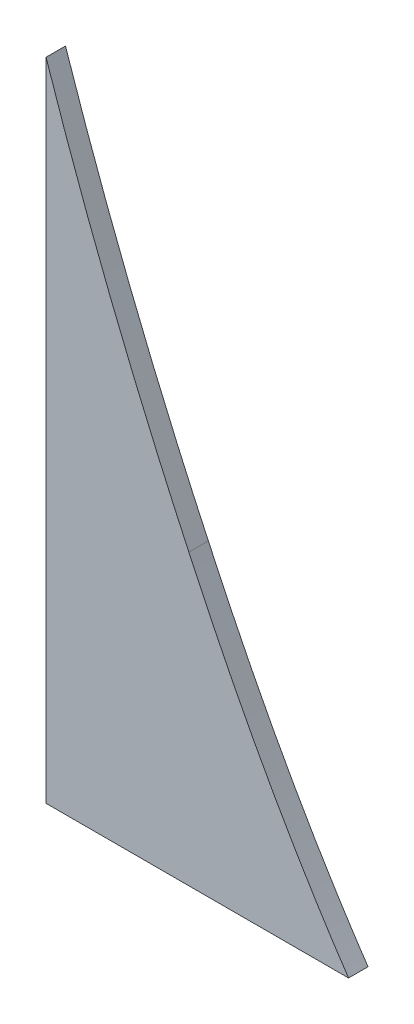
ISO-10303-21;
HEADER;
FILE_DESCRIPTION(('STEP AP214'),'2;1');
FILE_NAME('part.step','',(''),(''),'','','');
FILE_SCHEMA(('AUTOMOTIVE_DESIGN { 1 0 10303 214 1 1 1 1 }'));
ENDSEC;
DATA;
#1=APPLICATION_CONTEXT('core data for automotive mechanical design processes');
#2=APPLICATION_PROTOCOL_DEFINITION('international standard','automotive_design',2000,#1);
#3=PRODUCT_CONTEXT('',#1,'mechanical');
#4=PRODUCT('Part','Part','',(#3));
#5=PRODUCT_RELATED_PRODUCT_CATEGORY('part','',(#4));
#6=PRODUCT_DEFINITION_FORMATION('','',#4);
#7=PRODUCT_DEFINITION_CONTEXT('part definition',#1,'design');
#8=PRODUCT_DEFINITION('design','',#6,#7);
#9=PRODUCT_DEFINITION_SHAPE('','',#8);
#10=(LENGTH_UNIT() NAMED_UNIT(*) SI_UNIT(.MILLI.,.METRE.));
#11=(NAMED_UNIT(*) PLANE_ANGLE_UNIT() SI_UNIT($,.RADIAN.));
#12=(NAMED_UNIT(*) SI_UNIT($,.STERADIAN.) SOLID_ANGLE_UNIT());
#13=UNCERTAINTY_MEASURE_WITH_UNIT(LENGTH_MEASURE(1.E-05),#10,'distance_accuracy_value','');
#14=(GEOMETRIC_REPRESENTATION_CONTEXT(3) GLOBAL_UNCERTAINTY_ASSIGNED_CONTEXT((#13)) GLOBAL_UNIT_ASSIGNED_CONTEXT((#10,
#11,#12)) REPRESENTATION_CONTEXT('',''));
#15=CARTESIAN_POINT('',(0.,0.,0.));
#16=DIRECTION('',(0.,0.,1.));
#17=DIRECTION('',(1.,0.,0.));
#18=AXIS2_PLACEMENT_3D('',#15,#16,#17);
#19=CARTESIAN_POINT('',(4.77612366852551,23.6451075569913,2.));
#20=DIRECTION('',(0.,1.,0.));
#21=DIRECTION('',(0.,0.,1.));
#22=AXIS2_PLACEMENT_3D('',#19,#20,#21);
#23=PLANE('',#22);
#24=DIRECTION('',(1.,0.,0.));
#25=VECTOR('',#24,1.);
#26=CARTESIAN_POINT('',(4.77612366852551,23.6451075569913,0.));
#27=LINE('',#26,#25);
#28=CARTESIAN_POINT('',(4.77612366852551,23.6451075569913,0.));
#29=VERTEX_POINT('',#28);
#30=CARTESIAN_POINT('',(35.8718126294651,23.6451075569913,0.));
#31=VERTEX_POINT('',#30);
#32=EDGE_CURVE('E118',#29,#31,#27,.T.);
#33=ORIENTED_EDGE('',*,*,#32,.T.);
#34=DIRECTION('',(0.,0.,-1.));
#35=VECTOR('',#34,1.);
#36=CARTESIAN_POINT('',(35.8718126294651,23.6451075569913,2.));
#37=LINE('',#36,#35);
#38=CARTESIAN_POINT('',(35.8718126294651,23.6451075569913,2.));
#39=VERTEX_POINT('',#38);
#40=EDGE_CURVE('E11',#39,#31,#37,.T.);
#41=ORIENTED_EDGE('',*,*,#40,.F.);
#42=DIRECTION('',(1.,0.,0.));
#43=VECTOR('',#42,1.);
#44=CARTESIAN_POINT('',(4.77612366852551,23.6451075569913,2.));
#45=LINE('',#44,#43);
#46=CARTESIAN_POINT('',(4.77612366852551,23.6451075569913,2.));
#47=VERTEX_POINT('',#46);
#48=EDGE_CURVE('E72',#47,#39,#45,.T.);
#49=ORIENTED_EDGE('',*,*,#48,.F.);
#50=DIRECTION('',(0.,0.,-1.));
#51=VECTOR('',#50,1.);
#52=CARTESIAN_POINT('',(4.77612366852551,23.6451075569913,2.));
#53=LINE('',#52,#51);
#54=EDGE_CURVE('E91',#47,#29,#53,.T.);
#55=ORIENTED_EDGE('',*,*,#54,.T.);
#56=EDGE_LOOP('',(#33,#41,#49,#55));
#57=FACE_BOUND('',#56,.T.);
#58=ADVANCED_FACE('F33',(#57),#23,.F.);
#59=CARTESIAN_POINT('',(19.4619083423606,53.3454742486595,2.));
#60=CARTESIAN_POINT('',(27.3136326201002,36.3238927560504,2.));
#61=CARTESIAN_POINT('',(35.8718126294651,23.6451075569913,2.));
#62=B_SPLINE_CURVE_WITH_KNOTS('',2,(#59,#60,#61),.UNSPECIFIED.,.F.,.F.,(3,3),(0.,1.),.UNSPECIFIED.);
#63=DIRECTION('',(0.,0.,-1.));
#64=VECTOR('',#63,1.);
#65=SURFACE_OF_LINEAR_EXTRUSION('',#62,#64);
#66=CARTESIAN_POINT('',(19.4619083423606,53.3454742486595,0.));
#67=CARTESIAN_POINT('',(27.3136326201002,36.3238927560504,0.));
#68=CARTESIAN_POINT('',(35.8718126294651,23.6451075569913,0.));
#69=B_SPLINE_CURVE_WITH_KNOTS('',2,(#66,#67,#68),.UNSPECIFIED.,.F.,.F.,(3,3),(0.,1.),.UNSPECIFIED.);
#70=CARTESIAN_POINT('',(19.4619083423606,53.3454742486595,0.));
#71=VERTEX_POINT('',#70);
#72=EDGE_CURVE('E81',#71,#31,#69,.T.);
#73=ORIENTED_EDGE('',*,*,#72,.F.);
#74=DIRECTION('',(0.,0.,-1.));
#75=VECTOR('',#74,1.);
#76=CARTESIAN_POINT('',(19.4619083423606,53.3454742486595,2.));
#77=LINE('',#76,#75);
#78=CARTESIAN_POINT('',(19.4619083423606,53.3454742486595,2.));
#79=VERTEX_POINT('',#78);
#80=EDGE_CURVE('E41',#79,#71,#77,.T.);
#81=ORIENTED_EDGE('',*,*,#80,.F.);
#82=EDGE_CURVE('E79',#79,#39,#62,.T.);
#83=ORIENTED_EDGE('',*,*,#82,.T.);
#84=ORIENTED_EDGE('',*,*,#40,.T.);
#85=EDGE_LOOP('',(#73,#81,#83,#84));
#86=FACE_BOUND('',#85,.T.);
#87=ADVANCED_FACE('F78',(#86),#65,.T.);
#88=CARTESIAN_POINT('',(4.77612366852551,90.0599359332472,2.));
#89=CARTESIAN_POINT('',(11.0424682722589,71.3575550543689,2.));
#90=CARTESIAN_POINT('',(19.4619083423606,53.3454742486595,2.));
#91=B_SPLINE_CURVE_WITH_KNOTS('',2,(#88,#89,#90),.UNSPECIFIED.,.F.,.F.,(3,3),(0.,1.),.UNSPECIFIED.);
#92=DIRECTION('',(0.,0.,-1.));
#93=VECTOR('',#92,1.);
#94=SURFACE_OF_LINEAR_EXTRUSION('',#91,#93);
#95=CARTESIAN_POINT('',(4.77612366852551,90.0599359332472,0.));
#96=CARTESIAN_POINT('',(11.0424682722589,71.3575550543689,0.));
#97=CARTESIAN_POINT('',(19.4619083423606,53.3454742486595,0.));
#98=B_SPLINE_CURVE_WITH_KNOTS('',2,(#95,#96,#97),.UNSPECIFIED.,.F.,.F.,(3,3),(0.,1.),.UNSPECIFIED.);
#99=CARTESIAN_POINT('',(4.77612366852551,90.0599359332472,0.));
#100=VERTEX_POINT('',#99);
#101=EDGE_CURVE('E121',#100,#71,#98,.T.);
#102=ORIENTED_EDGE('',*,*,#101,.F.);
#103=DIRECTION('',(0.,0.,-1.));
#104=VECTOR('',#103,1.);
#105=CARTESIAN_POINT('',(4.77612366852551,90.0599359332472,2.));
#106=LINE('',#105,#104);
#107=CARTESIAN_POINT('',(4.77612366852551,90.0599359332472,2.));
#108=VERTEX_POINT('',#107);
#109=EDGE_CURVE('E64',#108,#100,#106,.T.);
#110=ORIENTED_EDGE('',*,*,#109,.F.);
#111=EDGE_CURVE('E87',#108,#79,#91,.T.);
#112=ORIENTED_EDGE('',*,*,#111,.T.);
#113=ORIENTED_EDGE('',*,*,#80,.T.);
#114=EDGE_LOOP('',(#102,#110,#112,#113));
#115=FACE_BOUND('',#114,.T.);
#116=ADVANCED_FACE('F89',(#115),#94,.T.);
#117=CARTESIAN_POINT('',(4.77612366852551,90.0599359332472,2.));
#118=DIRECTION('',(1.,0.,0.));
#119=DIRECTION('',(0.,0.,-1.));
#120=AXIS2_PLACEMENT_3D('',#117,#118,#119);
#121=PLANE('',#120);
#122=DIRECTION('',(0.,-1.,0.));
#123=VECTOR('',#122,1.);
#124=CARTESIAN_POINT('',(4.77612366852551,90.0599359332472,0.));
#125=LINE('',#124,#123);
#126=EDGE_CURVE('E67',#100,#29,#125,.T.);
#127=ORIENTED_EDGE('',*,*,#126,.T.);
#128=ORIENTED_EDGE('',*,*,#54,.F.);
#129=DIRECTION('',(0.,-1.,0.));
#130=VECTOR('',#129,1.);
#131=CARTESIAN_POINT('',(4.77612366852551,90.0599359332472,2.));
#132=LINE('',#131,#130);
#133=EDGE_CURVE('E49',#108,#47,#132,.T.);
#134=ORIENTED_EDGE('',*,*,#133,.F.);
#135=ORIENTED_EDGE('',*,*,#109,.T.);
#136=EDGE_LOOP('',(#127,#128,#134,#135));
#137=FACE_BOUND('',#136,.T.);
#138=ADVANCED_FACE('F107',(#137),#121,.F.);
#139=CARTESIAN_POINT('',(27.4902465530065,37.4095918294379,2.));
#140=DIRECTION('',(0.,0.,-1.));
#141=DIRECTION('',(-1.,0.,0.));
#142=AXIS2_PLACEMENT_3D('',#139,#140,#141);
#143=PLANE('',#142);
#144=ORIENTED_EDGE('',*,*,#48,.T.);
#145=ORIENTED_EDGE('',*,*,#82,.F.);
#146=ORIENTED_EDGE('',*,*,#111,.F.);
#147=ORIENTED_EDGE('',*,*,#133,.T.);
#148=EDGE_LOOP('',(#144,#145,#146,#147));
#149=FACE_BOUND('',#148,.T.);
#150=ADVANCED_FACE('F86',(#149),#143,.F.);
#151=CARTESIAN_POINT('',(27.4902465530065,37.4095918294379,0.));
#152=DIRECTION('',(0.,0.,-1.));
#153=DIRECTION('',(-1.,0.,0.));
#154=AXIS2_PLACEMENT_3D('',#151,#152,#153);
#155=PLANE('',#154);
#156=ORIENTED_EDGE('',*,*,#32,.F.);
#157=ORIENTED_EDGE('',*,*,#126,.F.);
#158=ORIENTED_EDGE('',*,*,#101,.T.);
#159=ORIENTED_EDGE('',*,*,#72,.T.);
#160=EDGE_LOOP('',(#156,#157,#158,#159));
#161=FACE_BOUND('',#160,.T.);
#162=ADVANCED_FACE('F120',(#161),#155,.T.);
#163=CLOSED_SHELL('',(#58,#87,#116,#138,#150,#162));
#164=MANIFOLD_SOLID_BREP('B2',#163);
#165=ADVANCED_BREP_SHAPE_REPRESENTATION('',(#18,#164),#14);
#166=SHAPE_DEFINITION_REPRESENTATION(#9,#165);
ENDSEC;
END-ISO-10303-21;
